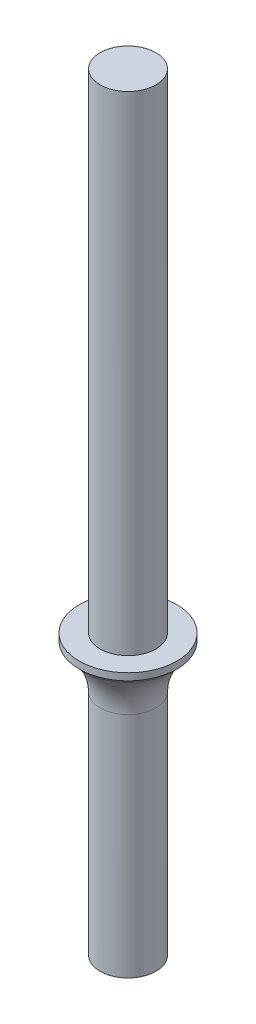
ISO-10303-21;
HEADER;
FILE_DESCRIPTION(('STEP AP214'),'2;1');
FILE_NAME('part.step','',(''),(''),'','','');
FILE_SCHEMA(('AUTOMOTIVE_DESIGN { 1 0 10303 214 1 1 1 1 }'));
ENDSEC;
DATA;
#1=APPLICATION_CONTEXT('core data for automotive mechanical design processes');
#2=APPLICATION_PROTOCOL_DEFINITION('international standard','automotive_design',2000,#1);
#3=PRODUCT_CONTEXT('',#1,'mechanical');
#4=PRODUCT('Part','Part','',(#3));
#5=PRODUCT_RELATED_PRODUCT_CATEGORY('part','',(#4));
#6=PRODUCT_DEFINITION_FORMATION('','',#4);
#7=PRODUCT_DEFINITION_CONTEXT('part definition',#1,'design');
#8=PRODUCT_DEFINITION('design','',#6,#7);
#9=PRODUCT_DEFINITION_SHAPE('','',#8);
#10=(LENGTH_UNIT() NAMED_UNIT(*) SI_UNIT(.MILLI.,.METRE.));
#11=(NAMED_UNIT(*) PLANE_ANGLE_UNIT() SI_UNIT($,.RADIAN.));
#12=(NAMED_UNIT(*) SI_UNIT($,.STERADIAN.) SOLID_ANGLE_UNIT());
#13=UNCERTAINTY_MEASURE_WITH_UNIT(LENGTH_MEASURE(1.E-05),#10,'distance_accuracy_value','');
#14=(GEOMETRIC_REPRESENTATION_CONTEXT(3) GLOBAL_UNCERTAINTY_ASSIGNED_CONTEXT((#13)) GLOBAL_UNIT_ASSIGNED_CONTEXT((#10,
#11,#12)) REPRESENTATION_CONTEXT('',''));
#15=CARTESIAN_POINT('',(0.,0.,0.));
#16=DIRECTION('',(0.,0.,1.));
#17=DIRECTION('',(1.,0.,0.));
#18=AXIS2_PLACEMENT_3D('',#15,#16,#17);
#19=CARTESIAN_POINT('',(0.,110.,0.));
#20=DIRECTION('',(0.,-1.,0.));
#21=DIRECTION('',(0.,0.,-1.));
#22=AXIS2_PLACEMENT_3D('',#19,#20,#21);
#23=CYLINDRICAL_SURFACE('',#22,4.);
#24=CARTESIAN_POINT('',(0.,110.,0.));
#25=DIRECTION('',(0.,1.,0.));
#26=DIRECTION('',(0.,0.,1.));
#27=AXIS2_PLACEMENT_3D('',#24,#25,#26);
#28=CIRCLE('',#27,4.);
#29=CARTESIAN_POINT('',(0.,110.,4.));
#30=VERTEX_POINT('',#29);
#31=EDGE_CURVE('E57',#30,#30,#28,.T.);
#32=ORIENTED_EDGE('',*,*,#31,.F.);
#33=EDGE_LOOP('',(#32));
#34=FACE_BOUND('',#33,.T.);
#35=CARTESIAN_POINT('',(0.,40.,0.));
#36=DIRECTION('',(0.,-1.,0.));
#37=DIRECTION('',(0.,0.,-1.));
#38=AXIS2_PLACEMENT_3D('',#35,#36,#37);
#39=CIRCLE('',#38,4.);
#40=CARTESIAN_POINT('',(0.,40.,-4.));
#41=VERTEX_POINT('',#40);
#42=EDGE_CURVE('E52',#41,#41,#39,.T.);
#43=ORIENTED_EDGE('',*,*,#42,.F.);
#44=EDGE_LOOP('',(#43));
#45=FACE_BOUND('',#44,.T.);
#46=ADVANCED_FACE('F39',(#34,#45),#23,.T.);
#47=CARTESIAN_POINT('',(0.,110.,0.));
#48=DIRECTION('',(0.,1.,0.));
#49=DIRECTION('',(0.,0.,1.));
#50=AXIS2_PLACEMENT_3D('',#47,#48,#49);
#51=PLANE('',#50);
#52=ORIENTED_EDGE('',*,*,#31,.T.);
#53=EDGE_LOOP('',(#52));
#54=FACE_BOUND('',#53,.T.);
#55=ADVANCED_FACE('F92',(#54),#51,.T.);
#56=CARTESIAN_POINT('',(0.,40.,0.));
#57=DIRECTION('',(0.,-1.,0.));
#58=DIRECTION('',(0.,0.,-1.));
#59=AXIS2_PLACEMENT_3D('',#56,#57,#58);
#60=CYLINDRICAL_SURFACE('',#59,7.);
#61=CARTESIAN_POINT('',(0.,40.,0.));
#62=DIRECTION('',(0.,-1.,0.));
#63=DIRECTION('',(0.,0.,-1.));
#64=AXIS2_PLACEMENT_3D('',#61,#62,#63);
#65=CIRCLE('',#64,7.);
#66=CARTESIAN_POINT('',(0.,40.,-7.));
#67=VERTEX_POINT('',#66);
#68=EDGE_CURVE('E64',#67,#67,#65,.T.);
#69=ORIENTED_EDGE('',*,*,#68,.T.);
#70=EDGE_LOOP('',(#69));
#71=FACE_BOUND('',#70,.T.);
#72=CARTESIAN_POINT('',(0.,39.,0.));
#73=DIRECTION('',(0.,-1.,0.));
#74=DIRECTION('',(0.,0.,-1.));
#75=AXIS2_PLACEMENT_3D('',#72,#73,#74);
#76=CIRCLE('',#75,7.);
#77=CARTESIAN_POINT('',(0.,39.,-7.));
#78=VERTEX_POINT('',#77);
#79=EDGE_CURVE('E68',#78,#78,#76,.T.);
#80=ORIENTED_EDGE('',*,*,#79,.F.);
#81=EDGE_LOOP('',(#80));
#82=FACE_BOUND('',#81,.T.);
#83=ADVANCED_FACE('F76',(#71,#82),#60,.T.);
#84=CARTESIAN_POINT('',(0.,40.,0.));
#85=DIRECTION('',(0.,-1.,0.));
#86=DIRECTION('',(0.,0.,-1.));
#87=AXIS2_PLACEMENT_3D('',#84,#85,#86);
#88=PLANE('',#87);
#89=ORIENTED_EDGE('',*,*,#42,.T.);
#90=EDGE_LOOP('',(#89));
#91=FACE_BOUND('',#90,.T.);
#92=ORIENTED_EDGE('',*,*,#68,.F.);
#93=EDGE_LOOP('',(#92));
#94=FACE_BOUND('',#93,.T.);
#95=ADVANCED_FACE('F79',(#91,#94),#88,.F.);
#96=CARTESIAN_POINT('',(0.,0.,0.));
#97=DIRECTION('',(0.,1.,0.));
#98=DIRECTION('',(0.,0.,1.));
#99=AXIS2_PLACEMENT_3D('',#96,#97,#98);
#100=PLANE('',#99);
#101=CARTESIAN_POINT('',(0.,0.,0.));
#102=DIRECTION('',(0.,1.,0.));
#103=DIRECTION('',(0.,0.,1.));
#104=AXIS2_PLACEMENT_3D('',#101,#102,#103);
#105=CIRCLE('',#104,4.);
#106=CARTESIAN_POINT('',(0.,0.,4.));
#107=VERTEX_POINT('',#106);
#108=EDGE_CURVE('E60',#107,#107,#105,.T.);
#109=ORIENTED_EDGE('',*,*,#108,.F.);
#110=EDGE_LOOP('',(#109));
#111=FACE_BOUND('',#110,.T.);
#112=ADVANCED_FACE('F81',(#111),#100,.F.);
#113=CARTESIAN_POINT('',(0.,32.6862915010152,0.));
#114=DIRECTION('',(0.,-1.,0.));
#115=DIRECTION('',(0.,0.,-1.));
#116=AXIS2_PLACEMENT_3D('',#113,#114,#115);
#117=CIRCLE('',#116,4.);
#118=CARTESIAN_POINT('',(0.,32.6862915010152,-4.));
#119=VERTEX_POINT('',#118);
#120=EDGE_CURVE('E47',#119,#119,#117,.T.);
#121=ORIENTED_EDGE('',*,*,#120,.T.);
#122=EDGE_LOOP('',(#121));
#123=FACE_BOUND('',#122,.T.);
#124=ORIENTED_EDGE('',*,*,#108,.T.);
#125=EDGE_LOOP('',(#124));
#126=FACE_BOUND('',#125,.T.);
#127=ADVANCED_FACE('F89',(#123,#126),#23,.T.);
#128=CARTESIAN_POINT('',(0.,36.,0.));
#129=DIRECTION('',(0.,1.,0.));
#130=DIRECTION('',(0.,0.,1.));
#131=AXIS2_PLACEMENT_3D('',#128,#129,#130);
#132=CONICAL_SURFACE('',#131,4.,0.785398163397442);
#133=CARTESIAN_POINT('',(0.,38.3431457505076,0.));
#134=DIRECTION('',(0.,1.,0.));
#135=DIRECTION('',(0.,0.,1.));
#136=AXIS2_PLACEMENT_3D('',#133,#134,#135);
#137=CIRCLE('',#136,6.34314575050758);
#138=CARTESIAN_POINT('',(0.,38.3431457505076,6.34314575050758));
#139=VERTEX_POINT('',#138);
#140=EDGE_CURVE('E10',#139,#139,#137,.T.);
#141=ORIENTED_EDGE('',*,*,#140,.T.);
#142=EDGE_LOOP('',(#141));
#143=FACE_BOUND('',#142,.T.);
#144=ORIENTED_EDGE('',*,*,#79,.T.);
#145=EDGE_LOOP('',(#144));
#146=FACE_BOUND('',#145,.T.);
#147=ADVANCED_FACE('F107',(#143,#146),#132,.T.);
#148=CARTESIAN_POINT('',(0.,32.6862915010152,0.));
#149=DIRECTION('',(0.,-1.,0.));
#150=DIRECTION('',(0.,0.,-1.));
#151=AXIS2_PLACEMENT_3D('',#148,#149,#150);
#152=TOROIDAL_SURFACE('',#151,12.,8.);
#153=ORIENTED_EDGE('',*,*,#140,.F.);
#154=EDGE_LOOP('',(#153));
#155=FACE_BOUND('',#154,.T.);
#156=ORIENTED_EDGE('',*,*,#120,.F.);
#157=EDGE_LOOP('',(#156));
#158=FACE_BOUND('',#157,.T.);
#159=ADVANCED_FACE('F41',(#155,#158),#152,.F.);
#160=CLOSED_SHELL('',(#46,#55,#83,#95,#112,#127,#147,#159));
#161=MANIFOLD_SOLID_BREP('B2',#160);
#162=ADVANCED_BREP_SHAPE_REPRESENTATION('',(#18,#161),#14);
#163=SHAPE_DEFINITION_REPRESENTATION(#9,#162);
ENDSEC;
END-ISO-10303-21;
